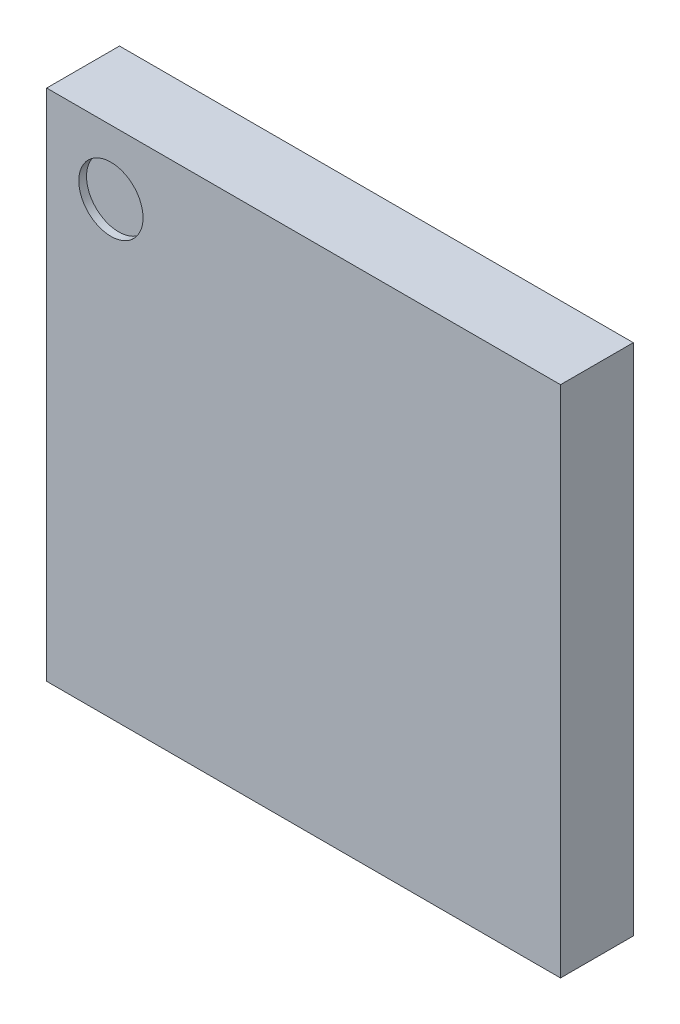
ISO-10303-21;
HEADER;
FILE_DESCRIPTION(('STEP AP214'),'2;1');
FILE_NAME('part.step','',(''),(''),'','','');
FILE_SCHEMA(('AUTOMOTIVE_DESIGN { 1 0 10303 214 1 1 1 1 }'));
ENDSEC;
DATA;
#1=APPLICATION_CONTEXT('core data for automotive mechanical design processes');
#2=APPLICATION_PROTOCOL_DEFINITION('international standard','automotive_design',2000,#1);
#3=PRODUCT_CONTEXT('',#1,'mechanical');
#4=PRODUCT('Part','Part','',(#3));
#5=PRODUCT_RELATED_PRODUCT_CATEGORY('part','',(#4));
#6=PRODUCT_DEFINITION_FORMATION('','',#4);
#7=PRODUCT_DEFINITION_CONTEXT('part definition',#1,'design');
#8=PRODUCT_DEFINITION('design','',#6,#7);
#9=PRODUCT_DEFINITION_SHAPE('','',#8);
#10=(LENGTH_UNIT() NAMED_UNIT(*) SI_UNIT(.MILLI.,.METRE.));
#11=(NAMED_UNIT(*) PLANE_ANGLE_UNIT() SI_UNIT($,.RADIAN.));
#12=(NAMED_UNIT(*) SI_UNIT($,.STERADIAN.) SOLID_ANGLE_UNIT());
#13=UNCERTAINTY_MEASURE_WITH_UNIT(LENGTH_MEASURE(1.E-05),#10,'distance_accuracy_value','');
#14=(GEOMETRIC_REPRESENTATION_CONTEXT(3) GLOBAL_UNCERTAINTY_ASSIGNED_CONTEXT((#13)) GLOBAL_UNIT_ASSIGNED_CONTEXT((#10,
#11,#12)) REPRESENTATION_CONTEXT('',''));
#15=CARTESIAN_POINT('',(0.,0.,0.));
#16=DIRECTION('',(0.,0.,1.));
#17=DIRECTION('',(1.,0.,0.));
#18=AXIS2_PLACEMENT_3D('',#15,#16,#17);
#19=CARTESIAN_POINT('',(-2.25,2.25,0.81));
#20=DIRECTION('',(0.,0.,1.));
#21=DIRECTION('',(1.,0.,0.));
#22=AXIS2_PLACEMENT_3D('',#19,#20,#21);
#23=PLANE('',#22);
#24=CARTESIAN_POINT('',(-2.25,2.25,0.81));
#25=DIRECTION('',(0.,0.,1.));
#26=DIRECTION('',(1.,0.,0.));
#27=AXIS2_PLACEMENT_3D('',#24,#25,#26);
#28=CIRCLE('',#27,0.375);
#29=CARTESIAN_POINT('',(-1.875,2.25,0.81));
#30=VERTEX_POINT('',#29);
#31=EDGE_CURVE('E20',#30,#30,#28,.T.);
#32=ORIENTED_EDGE('',*,*,#31,.T.);
#33=EDGE_LOOP('',(#32));
#34=FACE_BOUND('',#33,.T.);
#35=ADVANCED_FACE('F17',(#34),#23,.T.);
#36=CARTESIAN_POINT('',(-2.25,2.25,0.81));
#37=DIRECTION('',(0.,0.,1.));
#38=DIRECTION('',(1.,0.,0.));
#39=AXIS2_PLACEMENT_3D('',#36,#37,#38);
#40=CYLINDRICAL_SURFACE('',#39,0.375);
#41=CARTESIAN_POINT('',(-2.25,2.25,0.9));
#42=DIRECTION('',(0.,0.,1.));
#43=DIRECTION('',(1.,0.,0.));
#44=AXIS2_PLACEMENT_3D('',#41,#42,#43);
#45=CIRCLE('',#44,0.375);
#46=CARTESIAN_POINT('',(-1.875,2.25,0.9));
#47=VERTEX_POINT('',#46);
#48=EDGE_CURVE('E66',#47,#47,#45,.F.);
#49=ORIENTED_EDGE('',*,*,#48,.F.);
#50=EDGE_LOOP('',(#49));
#51=FACE_BOUND('',#50,.T.);
#52=ORIENTED_EDGE('',*,*,#31,.F.);
#53=EDGE_LOOP('',(#52));
#54=FACE_BOUND('',#53,.T.);
#55=ADVANCED_FACE('F87',(#51,#54),#40,.F.);
#56=CARTESIAN_POINT('',(-3.,-3.,0.9));
#57=DIRECTION('',(0.,0.,1.));
#58=DIRECTION('',(1.,0.,0.));
#59=AXIS2_PLACEMENT_3D('',#56,#57,#58);
#60=PLANE('',#59);
#61=ORIENTED_EDGE('',*,*,#48,.T.);
#62=EDGE_LOOP('',(#61));
#63=FACE_BOUND('',#62,.T.);
#64=DIRECTION('',(0.,1.,0.));
#65=VECTOR('',#64,1.);
#66=CARTESIAN_POINT('',(3.,-3.,0.9));
#67=LINE('',#66,#65);
#68=CARTESIAN_POINT('',(3.,3.,0.9));
#69=VERTEX_POINT('',#68);
#70=CARTESIAN_POINT('',(3.,-3.,0.9));
#71=VERTEX_POINT('',#70);
#72=EDGE_CURVE('E166',#69,#71,#67,.F.);
#73=ORIENTED_EDGE('',*,*,#72,.F.);
#74=DIRECTION('',(1.,0.,0.));
#75=VECTOR('',#74,1.);
#76=CARTESIAN_POINT('',(-3.,3.,0.9));
#77=LINE('',#76,#75);
#78=CARTESIAN_POINT('',(-3.,3.,0.9));
#79=VERTEX_POINT('',#78);
#80=EDGE_CURVE('E60',#79,#69,#77,.T.);
#81=ORIENTED_EDGE('',*,*,#80,.F.);
#82=DIRECTION('',(0.,1.,0.));
#83=VECTOR('',#82,1.);
#84=CARTESIAN_POINT('',(-3.,-3.,0.9));
#85=LINE('',#84,#83);
#86=CARTESIAN_POINT('',(-3.,-3.,0.9));
#87=VERTEX_POINT('',#86);
#88=EDGE_CURVE('E58',#79,#87,#85,.F.);
#89=ORIENTED_EDGE('',*,*,#88,.T.);
#90=DIRECTION('',(1.,0.,0.));
#91=VECTOR('',#90,1.);
#92=CARTESIAN_POINT('',(-3.,-3.,0.9));
#93=LINE('',#92,#91);
#94=EDGE_CURVE('E55',#87,#71,#93,.T.);
#95=ORIENTED_EDGE('',*,*,#94,.T.);
#96=EDGE_LOOP('',(#73,#81,#89,#95));
#97=FACE_BOUND('',#96,.T.);
#98=ADVANCED_FACE('F59',(#63,#97),#60,.T.);
#99=CARTESIAN_POINT('',(-3.,-3.,0.05));
#100=DIRECTION('',(1.,0.,0.));
#101=DIRECTION('',(0.,0.,-1.));
#102=AXIS2_PLACEMENT_3D('',#99,#100,#101);
#103=PLANE('',#102);
#104=DIRECTION('',(0.,0.,1.));
#105=VECTOR('',#104,1.);
#106=CARTESIAN_POINT('',(-3.,3.,0.05));
#107=LINE('',#106,#105);
#108=CARTESIAN_POINT('',(-3.,3.,0.05));
#109=VERTEX_POINT('',#108);
#110=EDGE_CURVE('E170',#109,#79,#107,.T.);
#111=ORIENTED_EDGE('',*,*,#110,.F.);
#112=DIRECTION('',(0.,1.,0.));
#113=VECTOR('',#112,1.);
#114=CARTESIAN_POINT('',(-3.,-3.,0.05));
#115=LINE('',#114,#113);
#116=CARTESIAN_POINT('',(-3.,-3.,0.05));
#117=VERTEX_POINT('',#116);
#118=EDGE_CURVE('E77',#109,#117,#115,.F.);
#119=ORIENTED_EDGE('',*,*,#118,.T.);
#120=DIRECTION('',(0.,0.,1.));
#121=VECTOR('',#120,1.);
#122=CARTESIAN_POINT('',(-3.,-3.,0.05));
#123=LINE('',#122,#121);
#124=EDGE_CURVE('E65',#117,#87,#123,.T.);
#125=ORIENTED_EDGE('',*,*,#124,.T.);
#126=ORIENTED_EDGE('',*,*,#88,.F.);
#127=EDGE_LOOP('',(#111,#119,#125,#126));
#128=FACE_BOUND('',#127,.T.);
#129=ADVANCED_FACE('F76',(#128),#103,.F.);
#130=CARTESIAN_POINT('',(-3.,-3.,0.05));
#131=DIRECTION('',(0.,1.,0.));
#132=DIRECTION('',(0.,0.,1.));
#133=AXIS2_PLACEMENT_3D('',#130,#131,#132);
#134=PLANE('',#133);
#135=ORIENTED_EDGE('',*,*,#94,.F.);
#136=ORIENTED_EDGE('',*,*,#124,.F.);
#137=DIRECTION('',(1.,0.,0.));
#138=VECTOR('',#137,1.);
#139=CARTESIAN_POINT('',(-3.,-3.,0.05));
#140=LINE('',#139,#138);
#141=CARTESIAN_POINT('',(3.,-3.,0.05));
#142=VERTEX_POINT('',#141);
#143=EDGE_CURVE('E168',#117,#142,#140,.T.);
#144=ORIENTED_EDGE('',*,*,#143,.T.);
#145=DIRECTION('',(0.,0.,-1.));
#146=VECTOR('',#145,1.);
#147=CARTESIAN_POINT('',(3.,-3.,0.05));
#148=LINE('',#147,#146);
#149=EDGE_CURVE('E73',#71,#142,#148,.T.);
#150=ORIENTED_EDGE('',*,*,#149,.F.);
#151=EDGE_LOOP('',(#135,#136,#144,#150));
#152=FACE_BOUND('',#151,.T.);
#153=ADVANCED_FACE('F70',(#152),#134,.F.);
#154=CARTESIAN_POINT('',(3.,-3.,0.05));
#155=DIRECTION('',(1.,0.,0.));
#156=DIRECTION('',(0.,0.,-1.));
#157=AXIS2_PLACEMENT_3D('',#154,#155,#156);
#158=PLANE('',#157);
#159=DIRECTION('',(0.,0.,1.));
#160=VECTOR('',#159,1.);
#161=CARTESIAN_POINT('',(3.,3.,0.05));
#162=LINE('',#161,#160);
#163=CARTESIAN_POINT('',(3.,3.,0.05));
#164=VERTEX_POINT('',#163);
#165=EDGE_CURVE('E34',#69,#164,#162,.F.);
#166=ORIENTED_EDGE('',*,*,#165,.F.);
#167=ORIENTED_EDGE('',*,*,#72,.T.);
#168=ORIENTED_EDGE('',*,*,#149,.T.);
#169=DIRECTION('',(0.,1.,0.));
#170=VECTOR('',#169,1.);
#171=CARTESIAN_POINT('',(3.,-3.,0.05));
#172=LINE('',#171,#170);
#173=EDGE_CURVE('E26',#142,#164,#172,.T.);
#174=ORIENTED_EDGE('',*,*,#173,.T.);
#175=EDGE_LOOP('',(#166,#167,#168,#174));
#176=FACE_BOUND('',#175,.T.);
#177=ADVANCED_FACE('F104',(#176),#158,.T.);
#178=CARTESIAN_POINT('',(-3.,3.,0.05));
#179=DIRECTION('',(0.,1.,0.));
#180=DIRECTION('',(0.,0.,1.));
#181=AXIS2_PLACEMENT_3D('',#178,#179,#180);
#182=PLANE('',#181);
#183=ORIENTED_EDGE('',*,*,#80,.T.);
#184=ORIENTED_EDGE('',*,*,#165,.T.);
#185=DIRECTION('',(1.,0.,0.));
#186=VECTOR('',#185,1.);
#187=CARTESIAN_POINT('',(-3.,3.,0.05));
#188=LINE('',#187,#186);
#189=EDGE_CURVE('E11',#164,#109,#188,.F.);
#190=ORIENTED_EDGE('',*,*,#189,.T.);
#191=ORIENTED_EDGE('',*,*,#110,.T.);
#192=EDGE_LOOP('',(#183,#184,#190,#191));
#193=FACE_BOUND('',#192,.T.);
#194=ADVANCED_FACE('F98',(#193),#182,.T.);
#195=CARTESIAN_POINT('',(-3.,-3.,0.05));
#196=DIRECTION('',(0.,0.,1.));
#197=DIRECTION('',(1.,0.,0.));
#198=AXIS2_PLACEMENT_3D('',#195,#196,#197);
#199=PLANE('',#198);
#200=ORIENTED_EDGE('',*,*,#173,.F.);
#201=ORIENTED_EDGE('',*,*,#143,.F.);
#202=ORIENTED_EDGE('',*,*,#118,.F.);
#203=ORIENTED_EDGE('',*,*,#189,.F.);
#204=EDGE_LOOP('',(#200,#201,#202,#203));
#205=FACE_BOUND('',#204,.T.);
#206=ADVANCED_FACE('F96',(#205),#199,.F.);
#207=CLOSED_SHELL('',(#35,#55,#98,#129,#153,#177,#194,#206));
#208=MANIFOLD_SOLID_BREP('B1',#207);
#209=ADVANCED_BREP_SHAPE_REPRESENTATION('',(#18,#208),#14);
#210=SHAPE_DEFINITION_REPRESENTATION(#9,#209);
ENDSEC;
END-ISO-10303-21;
